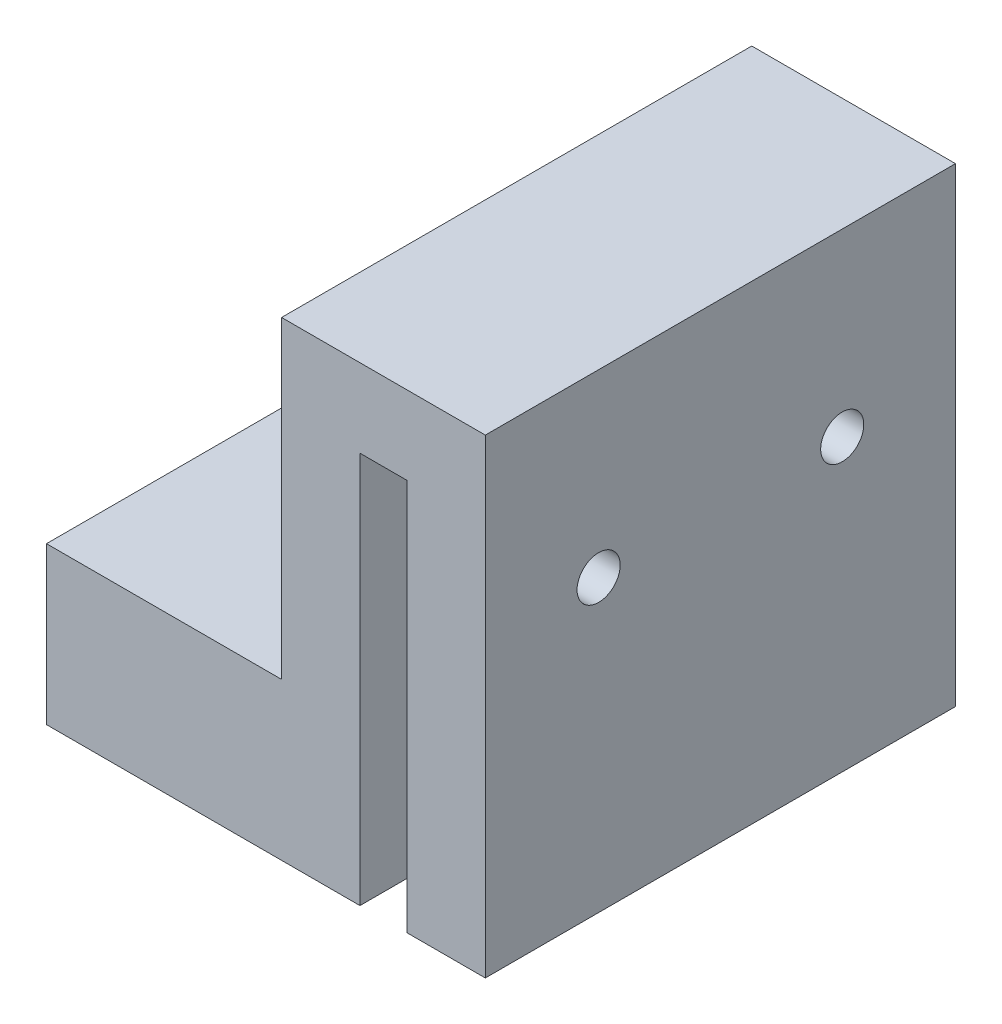
ISO-10303-21;
HEADER;
FILE_DESCRIPTION(('STEP AP214'),'2;1');
FILE_NAME('part.step','',(''),(''),'','','');
FILE_SCHEMA(('AUTOMOTIVE_DESIGN { 1 0 10303 214 1 1 1 1 }'));
ENDSEC;
DATA;
#1=APPLICATION_CONTEXT('core data for automotive mechanical design processes');
#2=APPLICATION_PROTOCOL_DEFINITION('international standard','automotive_design',2000,#1);
#3=PRODUCT_CONTEXT('',#1,'mechanical');
#4=PRODUCT('Part','Part','',(#3));
#5=PRODUCT_RELATED_PRODUCT_CATEGORY('part','',(#4));
#6=PRODUCT_DEFINITION_FORMATION('','',#4);
#7=PRODUCT_DEFINITION_CONTEXT('part definition',#1,'design');
#8=PRODUCT_DEFINITION('design','',#6,#7);
#9=PRODUCT_DEFINITION_SHAPE('','',#8);
#10=(LENGTH_UNIT() NAMED_UNIT(*) SI_UNIT(.MILLI.,.METRE.));
#11=(NAMED_UNIT(*) PLANE_ANGLE_UNIT() SI_UNIT($,.RADIAN.));
#12=(NAMED_UNIT(*) SI_UNIT($,.STERADIAN.) SOLID_ANGLE_UNIT());
#13=UNCERTAINTY_MEASURE_WITH_UNIT(LENGTH_MEASURE(1.E-05),#10,'distance_accuracy_value','');
#14=(GEOMETRIC_REPRESENTATION_CONTEXT(3) GLOBAL_UNCERTAINTY_ASSIGNED_CONTEXT((#13)) GLOBAL_UNIT_ASSIGNED_CONTEXT((#10,
#11,#12)) REPRESENTATION_CONTEXT('',''));
#15=CARTESIAN_POINT('',(0.,0.,0.));
#16=DIRECTION('',(0.,0.,1.));
#17=DIRECTION('',(1.,0.,0.));
#18=AXIS2_PLACEMENT_3D('',#15,#16,#17);
#19=CARTESIAN_POINT('',(-56.,0.,60.));
#20=DIRECTION('',(0.,1.,0.));
#21=DIRECTION('',(0.,0.,1.));
#22=AXIS2_PLACEMENT_3D('',#19,#20,#21);
#23=PLANE('',#22);
#24=DIRECTION('',(1.,0.,0.));
#25=VECTOR('',#24,1.);
#26=CARTESIAN_POINT('',(-56.,0.,0.));
#27=LINE('',#26,#25);
#28=CARTESIAN_POINT('',(-56.,0.,0.));
#29=VERTEX_POINT('',#28);
#30=CARTESIAN_POINT('',(-16.,0.,0.));
#31=VERTEX_POINT('',#30);
#32=EDGE_CURVE('E174',#29,#31,#27,.T.);
#33=ORIENTED_EDGE('',*,*,#32,.T.);
#34=DIRECTION('',(0.,0.,-1.));
#35=VECTOR('',#34,1.);
#36=CARTESIAN_POINT('',(-16.,0.,60.));
#37=LINE('',#36,#35);
#38=CARTESIAN_POINT('',(-16.,0.,60.));
#39=VERTEX_POINT('',#38);
#40=EDGE_CURVE('E151',#39,#31,#37,.T.);
#41=ORIENTED_EDGE('',*,*,#40,.F.);
#42=DIRECTION('',(1.,0.,0.));
#43=VECTOR('',#42,1.);
#44=CARTESIAN_POINT('',(-56.,0.,60.));
#45=LINE('',#44,#43);
#46=CARTESIAN_POINT('',(-56.,0.,60.));
#47=VERTEX_POINT('',#46);
#48=EDGE_CURVE('E139',#47,#39,#45,.T.);
#49=ORIENTED_EDGE('',*,*,#48,.F.);
#50=DIRECTION('',(0.,0.,-1.));
#51=VECTOR('',#50,1.);
#52=CARTESIAN_POINT('',(-56.,0.,60.));
#53=LINE('',#52,#51);
#54=EDGE_CURVE('E184',#47,#29,#53,.T.);
#55=ORIENTED_EDGE('',*,*,#54,.T.);
#56=EDGE_LOOP('',(#33,#41,#49,#55));
#57=FACE_BOUND('',#56,.T.);
#58=DIRECTION('',(0.,0.,-1.));
#59=VECTOR('',#58,1.);
#60=CARTESIAN_POINT('',(-31.,0.,60.));
#61=LINE('',#60,#59);
#62=CARTESIAN_POINT('',(-31.,0.,34.875));
#63=VERTEX_POINT('',#62);
#64=CARTESIAN_POINT('',(-31.,0.,25.125));
#65=VERTEX_POINT('',#64);
#66=EDGE_CURVE('E54',#63,#65,#61,.T.);
#67=ORIENTED_EDGE('',*,*,#66,.T.);
#68=DIRECTION('',(-0.866025403784439,0.,-0.5));
#69=VECTOR('',#68,1.);
#70=CARTESIAN_POINT('',(-34.6486820215088,0.,23.0184324526945));
#71=LINE('',#70,#69);
#72=CARTESIAN_POINT('',(-39.4437476868983,0.,20.25));
#73=VERTEX_POINT('',#72);
#74=EDGE_CURVE('E246',#65,#73,#71,.T.);
#75=ORIENTED_EDGE('',*,*,#74,.T.);
#76=DIRECTION('',(-0.866025403784439,0.,0.5));
#77=VECTOR('',#76,1.);
#78=CARTESIAN_POINT('',(-69.0731918219403,0.,37.3565675473055));
#79=LINE('',#78,#77);
#80=CARTESIAN_POINT('',(-47.8874953737966,0.,25.125));
#81=VERTEX_POINT('',#80);
#82=EDGE_CURVE('E249',#73,#81,#79,.T.);
#83=ORIENTED_EDGE('',*,*,#82,.T.);
#84=DIRECTION('',(0.,0.,1.));
#85=VECTOR('',#84,1.);
#86=CARTESIAN_POINT('',(-47.8874953737966,0.,60.));
#87=LINE('',#86,#85);
#88=CARTESIAN_POINT('',(-47.8874953737966,0.,34.875));
#89=VERTEX_POINT('',#88);
#90=EDGE_CURVE('E252',#81,#89,#87,.T.);
#91=ORIENTED_EDGE('',*,*,#90,.T.);
#92=DIRECTION('',(0.866025403784438,0.,0.500000000000001));
#93=VECTOR('',#92,1.);
#94=CARTESIAN_POINT('',(-43.0924297084071,0.,37.6434324526945));
#95=LINE('',#94,#93);
#96=CARTESIAN_POINT('',(-39.4437476868983,0.,39.75));
#97=VERTEX_POINT('',#96);
#98=EDGE_CURVE('E255',#89,#97,#95,.T.);
#99=ORIENTED_EDGE('',*,*,#98,.T.);
#100=DIRECTION('',(0.866025403784439,0.,-0.5));
#101=VECTOR('',#100,1.);
#102=CARTESIAN_POINT('',(-60.629444135042,0.,51.9815675473055));
#103=LINE('',#102,#101);
#104=EDGE_CURVE('E229',#97,#63,#103,.T.);
#105=ORIENTED_EDGE('',*,*,#104,.T.);
#106=EDGE_LOOP('',(#67,#75,#83,#91,#99,#105));
#107=FACE_BOUND('',#106,.T.);
#108=ADVANCED_FACE('F37',(#57,#107),#23,.F.);
#109=CARTESIAN_POINT('',(-10.,0.,60.));
#110=DIRECTION('',(0.,1.,0.));
#111=DIRECTION('',(0.,0.,1.));
#112=AXIS2_PLACEMENT_3D('',#109,#110,#111);
#113=PLANE('',#112);
#114=DIRECTION('',(1.,0.,0.));
#115=VECTOR('',#114,1.);
#116=CARTESIAN_POINT('',(-10.,0.,0.));
#117=LINE('',#116,#115);
#118=CARTESIAN_POINT('',(-10.,0.,0.));
#119=VERTEX_POINT('',#118);
#120=CARTESIAN_POINT('',(0.,0.,0.));
#121=VERTEX_POINT('',#120);
#122=EDGE_CURVE('E160',#119,#121,#117,.T.);
#123=ORIENTED_EDGE('',*,*,#122,.T.);
#124=DIRECTION('',(0.,0.,-1.));
#125=VECTOR('',#124,1.);
#126=CARTESIAN_POINT('',(0.,0.,60.));
#127=LINE('',#126,#125);
#128=CARTESIAN_POINT('',(0.,0.,60.));
#129=VERTEX_POINT('',#128);
#130=EDGE_CURVE('E11',#129,#121,#127,.T.);
#131=ORIENTED_EDGE('',*,*,#130,.F.);
#132=DIRECTION('',(1.,0.,0.));
#133=VECTOR('',#132,1.);
#134=CARTESIAN_POINT('',(-10.,0.,60.));
#135=LINE('',#134,#133);
#136=CARTESIAN_POINT('',(-10.,0.,60.));
#137=VERTEX_POINT('',#136);
#138=EDGE_CURVE('E180',#137,#129,#135,.T.);
#139=ORIENTED_EDGE('',*,*,#138,.F.);
#140=DIRECTION('',(0.,0.,-1.));
#141=VECTOR('',#140,1.);
#142=CARTESIAN_POINT('',(-10.,0.,60.));
#143=LINE('',#142,#141);
#144=EDGE_CURVE('E156',#137,#119,#143,.T.);
#145=ORIENTED_EDGE('',*,*,#144,.T.);
#146=EDGE_LOOP('',(#123,#131,#139,#145));
#147=FACE_BOUND('',#146,.T.);
#148=ADVANCED_FACE('F39',(#147),#113,.F.);
#149=CARTESIAN_POINT('',(0.,0.,60.));
#150=DIRECTION('',(-1.,0.,0.));
#151=DIRECTION('',(0.,0.,1.));
#152=AXIS2_PLACEMENT_3D('',#149,#150,#151);
#153=PLANE('',#152);
#154=CARTESIAN_POINT('',(0.,37.0311675602959,14.4586466217022));
#155=DIRECTION('',(-1.,0.,0.));
#156=DIRECTION('',(0.,0.,1.));
#157=AXIS2_PLACEMENT_3D('',#154,#155,#156);
#158=CIRCLE('',#157,2.75);
#159=CARTESIAN_POINT('',(0.,37.0311675602959,17.2086466217022));
#160=VERTEX_POINT('',#159);
#161=EDGE_CURVE('E219',#160,#160,#158,.T.);
#162=ORIENTED_EDGE('',*,*,#161,.T.);
#163=EDGE_LOOP('',(#162));
#164=FACE_BOUND('',#163,.T.);
#165=CARTESIAN_POINT('',(0.,37.0311675602959,45.5413533782978));
#166=DIRECTION('',(-1.,0.,0.));
#167=DIRECTION('',(0.,0.,1.));
#168=AXIS2_PLACEMENT_3D('',#165,#166,#167);
#169=CIRCLE('',#168,2.75);
#170=CARTESIAN_POINT('',(0.,37.0311675602959,48.2913533782978));
#171=VERTEX_POINT('',#170);
#172=EDGE_CURVE('E204',#171,#171,#169,.T.);
#173=ORIENTED_EDGE('',*,*,#172,.T.);
#174=EDGE_LOOP('',(#173));
#175=FACE_BOUND('',#174,.T.);
#176=DIRECTION('',(0.,1.,0.));
#177=VECTOR('',#176,1.);
#178=CARTESIAN_POINT('',(0.,0.,0.));
#179=LINE('',#178,#177);
#180=CARTESIAN_POINT('',(0.,60.,0.));
#181=VERTEX_POINT('',#180);
#182=EDGE_CURVE('E163',#121,#181,#179,.T.);
#183=ORIENTED_EDGE('',*,*,#182,.T.);
#184=DIRECTION('',(0.,0.,-1.));
#185=VECTOR('',#184,1.);
#186=CARTESIAN_POINT('',(0.,60.,60.));
#187=LINE('',#186,#185);
#188=CARTESIAN_POINT('',(0.,60.,60.));
#189=VERTEX_POINT('',#188);
#190=EDGE_CURVE('E46',#189,#181,#187,.T.);
#191=ORIENTED_EDGE('',*,*,#190,.F.);
#192=DIRECTION('',(0.,1.,0.));
#193=VECTOR('',#192,1.);
#194=CARTESIAN_POINT('',(0.,0.,60.));
#195=LINE('',#194,#193);
#196=EDGE_CURVE('E110',#129,#189,#195,.T.);
#197=ORIENTED_EDGE('',*,*,#196,.F.);
#198=ORIENTED_EDGE('',*,*,#130,.T.);
#199=EDGE_LOOP('',(#183,#191,#197,#198));
#200=FACE_BOUND('',#199,.T.);
#201=ADVANCED_FACE('F305',(#164,#175,#200),#153,.F.);
#202=CARTESIAN_POINT('',(0.,60.,60.));
#203=DIRECTION('',(0.,-1.,0.));
#204=DIRECTION('',(0.,0.,-1.));
#205=AXIS2_PLACEMENT_3D('',#202,#203,#204);
#206=PLANE('',#205);
#207=DIRECTION('',(-1.,0.,0.));
#208=VECTOR('',#207,1.);
#209=CARTESIAN_POINT('',(0.,60.,0.));
#210=LINE('',#209,#208);
#211=CARTESIAN_POINT('',(-26.,60.,0.));
#212=VERTEX_POINT('',#211);
#213=EDGE_CURVE('E166',#181,#212,#210,.T.);
#214=ORIENTED_EDGE('',*,*,#213,.T.);
#215=DIRECTION('',(0.,0.,-1.));
#216=VECTOR('',#215,1.);
#217=CARTESIAN_POINT('',(-26.,60.,60.));
#218=LINE('',#217,#216);
#219=CARTESIAN_POINT('',(-26.,60.,60.));
#220=VERTEX_POINT('',#219);
#221=EDGE_CURVE('E193',#220,#212,#218,.T.);
#222=ORIENTED_EDGE('',*,*,#221,.F.);
#223=DIRECTION('',(-1.,0.,0.));
#224=VECTOR('',#223,1.);
#225=CARTESIAN_POINT('',(0.,60.,60.));
#226=LINE('',#225,#224);
#227=EDGE_CURVE('E279',#189,#220,#226,.T.);
#228=ORIENTED_EDGE('',*,*,#227,.F.);
#229=ORIENTED_EDGE('',*,*,#190,.T.);
#230=EDGE_LOOP('',(#214,#222,#228,#229));
#231=FACE_BOUND('',#230,.T.);
#232=ADVANCED_FACE('F308',(#231),#206,.F.);
#233=CARTESIAN_POINT('',(-26.,60.,60.));
#234=DIRECTION('',(1.,0.,0.));
#235=DIRECTION('',(0.,1.,0.));
#236=AXIS2_PLACEMENT_3D('',#233,#234,#235);
#237=PLANE('',#236);
#238=CARTESIAN_POINT('',(-26.,37.0311675602959,14.4586466217022));
#239=DIRECTION('',(-1.,0.,0.));
#240=DIRECTION('',(0.,-1.,0.));
#241=AXIS2_PLACEMENT_3D('',#238,#239,#240);
#242=CIRCLE('',#241,2.75);
#243=CARTESIAN_POINT('',(-26.,34.2811675602959,14.4586466217022));
#244=VERTEX_POINT('',#243);
#245=EDGE_CURVE('E200',#244,#244,#242,.T.);
#246=ORIENTED_EDGE('',*,*,#245,.F.);
#247=EDGE_LOOP('',(#246));
#248=FACE_BOUND('',#247,.T.);
#249=CARTESIAN_POINT('',(-26.,37.0311675602959,45.5413533782978));
#250=DIRECTION('',(-1.,0.,0.));
#251=DIRECTION('',(0.,-1.,0.));
#252=AXIS2_PLACEMENT_3D('',#249,#250,#251);
#253=CIRCLE('',#252,2.75);
#254=CARTESIAN_POINT('',(-26.,34.2811675602959,45.5413533782978));
#255=VERTEX_POINT('',#254);
#256=EDGE_CURVE('E207',#255,#255,#253,.T.);
#257=ORIENTED_EDGE('',*,*,#256,.F.);
#258=EDGE_LOOP('',(#257));
#259=FACE_BOUND('',#258,.T.);
#260=DIRECTION('',(0.,-1.,0.));
#261=VECTOR('',#260,1.);
#262=CARTESIAN_POINT('',(-26.,60.,0.));
#263=LINE('',#262,#261);
#264=CARTESIAN_POINT('',(-26.,20.,0.));
#265=VERTEX_POINT('',#264);
#266=EDGE_CURVE('E168',#212,#265,#263,.T.);
#267=ORIENTED_EDGE('',*,*,#266,.T.);
#268=DIRECTION('',(0.,0.,-1.));
#269=VECTOR('',#268,1.);
#270=CARTESIAN_POINT('',(-26.,20.,60.));
#271=LINE('',#270,#269);
#272=CARTESIAN_POINT('',(-26.,20.,60.));
#273=VERTEX_POINT('',#272);
#274=EDGE_CURVE('E190',#273,#265,#271,.T.);
#275=ORIENTED_EDGE('',*,*,#274,.F.);
#276=DIRECTION('',(0.,-1.,0.));
#277=VECTOR('',#276,1.);
#278=CARTESIAN_POINT('',(-26.,60.,60.));
#279=LINE('',#278,#277);
#280=EDGE_CURVE('E281',#220,#273,#279,.T.);
#281=ORIENTED_EDGE('',*,*,#280,.F.);
#282=ORIENTED_EDGE('',*,*,#221,.T.);
#283=EDGE_LOOP('',(#267,#275,#281,#282));
#284=FACE_BOUND('',#283,.T.);
#285=ADVANCED_FACE('F313',(#248,#259,#284),#237,.F.);
#286=CARTESIAN_POINT('',(-26.,20.,60.));
#287=DIRECTION('',(0.,-1.,0.));
#288=DIRECTION('',(1.,0.,0.));
#289=AXIS2_PLACEMENT_3D('',#286,#287,#288);
#290=PLANE('',#289);
#291=CARTESIAN_POINT('',(-39.4437476868983,20.,30.));
#292=DIRECTION('',(0.,1.,0.));
#293=DIRECTION('',(-1.,0.,0.));
#294=AXIS2_PLACEMENT_3D('',#291,#292,#293);
#295=CIRCLE('',#294,5.99999999999999);
#296=CARTESIAN_POINT('',(-45.4437476868983,20.,30.));
#297=VERTEX_POINT('',#296);
#298=EDGE_CURVE('E164',#297,#297,#295,.T.);
#299=ORIENTED_EDGE('',*,*,#298,.F.);
#300=EDGE_LOOP('',(#299));
#301=FACE_BOUND('',#300,.T.);
#302=DIRECTION('',(-1.,0.,0.));
#303=VECTOR('',#302,1.);
#304=CARTESIAN_POINT('',(-26.,20.,0.));
#305=LINE('',#304,#303);
#306=CARTESIAN_POINT('',(-56.,20.,0.));
#307=VERTEX_POINT('',#306);
#308=EDGE_CURVE('E170',#265,#307,#305,.T.);
#309=ORIENTED_EDGE('',*,*,#308,.T.);
#310=DIRECTION('',(0.,0.,-1.));
#311=VECTOR('',#310,1.);
#312=CARTESIAN_POINT('',(-56.,20.,60.));
#313=LINE('',#312,#311);
#314=CARTESIAN_POINT('',(-56.,20.,60.));
#315=VERTEX_POINT('',#314);
#316=EDGE_CURVE('E187',#315,#307,#313,.T.);
#317=ORIENTED_EDGE('',*,*,#316,.F.);
#318=DIRECTION('',(-1.,0.,0.));
#319=VECTOR('',#318,1.);
#320=CARTESIAN_POINT('',(-26.,20.,60.));
#321=LINE('',#320,#319);
#322=EDGE_CURVE('E283',#273,#315,#321,.T.);
#323=ORIENTED_EDGE('',*,*,#322,.F.);
#324=ORIENTED_EDGE('',*,*,#274,.T.);
#325=EDGE_LOOP('',(#309,#317,#323,#324));
#326=FACE_BOUND('',#325,.T.);
#327=ADVANCED_FACE('F316',(#301,#326),#290,.F.);
#328=CARTESIAN_POINT('',(-56.,20.,60.));
#329=DIRECTION('',(1.,0.,0.));
#330=DIRECTION('',(0.,0.,-1.));
#331=AXIS2_PLACEMENT_3D('',#328,#329,#330);
#332=PLANE('',#331);
#333=DIRECTION('',(0.,-1.,0.));
#334=VECTOR('',#333,1.);
#335=CARTESIAN_POINT('',(-56.,20.,0.));
#336=LINE('',#335,#334);
#337=EDGE_CURVE('E172',#307,#29,#336,.T.);
#338=ORIENTED_EDGE('',*,*,#337,.T.);
#339=ORIENTED_EDGE('',*,*,#54,.F.);
#340=DIRECTION('',(0.,-1.,0.));
#341=VECTOR('',#340,1.);
#342=CARTESIAN_POINT('',(-56.,20.,60.));
#343=LINE('',#342,#341);
#344=EDGE_CURVE('E285',#315,#47,#343,.T.);
#345=ORIENTED_EDGE('',*,*,#344,.F.);
#346=ORIENTED_EDGE('',*,*,#316,.T.);
#347=EDGE_LOOP('',(#338,#339,#345,#346));
#348=FACE_BOUND('',#347,.T.);
#349=ADVANCED_FACE('F291',(#348),#332,.F.);
#350=CARTESIAN_POINT('',(-16.,0.,60.));
#351=DIRECTION('',(-1.,0.,0.));
#352=DIRECTION('',(0.,0.,1.));
#353=AXIS2_PLACEMENT_3D('',#350,#351,#352);
#354=PLANE('',#353);
#355=CARTESIAN_POINT('',(-16.,37.0311675602959,14.4586466217022));
#356=DIRECTION('',(-1.,0.,0.));
#357=DIRECTION('',(0.,0.,1.));
#358=AXIS2_PLACEMENT_3D('',#355,#356,#357);
#359=CIRCLE('',#358,2.75);
#360=CARTESIAN_POINT('',(-16.,37.0311675602959,17.2086466217022));
#361=VERTEX_POINT('',#360);
#362=EDGE_CURVE('E216',#361,#361,#359,.T.);
#363=ORIENTED_EDGE('',*,*,#362,.T.);
#364=EDGE_LOOP('',(#363));
#365=FACE_BOUND('',#364,.T.);
#366=CARTESIAN_POINT('',(-16.,37.0311675602959,45.5413533782978));
#367=DIRECTION('',(-1.,0.,0.));
#368=DIRECTION('',(0.,0.,1.));
#369=AXIS2_PLACEMENT_3D('',#366,#367,#368);
#370=CIRCLE('',#369,2.75);
#371=CARTESIAN_POINT('',(-16.,37.0311675602959,48.2913533782978));
#372=VERTEX_POINT('',#371);
#373=EDGE_CURVE('E199',#372,#372,#370,.T.);
#374=ORIENTED_EDGE('',*,*,#373,.T.);
#375=EDGE_LOOP('',(#374));
#376=FACE_BOUND('',#375,.T.);
#377=DIRECTION('',(0.,1.,0.));
#378=VECTOR('',#377,1.);
#379=CARTESIAN_POINT('',(-16.,0.,0.));
#380=LINE('',#379,#378);
#381=CARTESIAN_POINT('',(-16.,50.,0.));
#382=VERTEX_POINT('',#381);
#383=EDGE_CURVE('E148',#31,#382,#380,.T.);
#384=ORIENTED_EDGE('',*,*,#383,.T.);
#385=DIRECTION('',(0.,0.,-1.));
#386=VECTOR('',#385,1.);
#387=CARTESIAN_POINT('',(-16.,50.,60.));
#388=LINE('',#387,#386);
#389=CARTESIAN_POINT('',(-16.,50.,60.));
#390=VERTEX_POINT('',#389);
#391=EDGE_CURVE('E145',#390,#382,#388,.T.);
#392=ORIENTED_EDGE('',*,*,#391,.F.);
#393=DIRECTION('',(0.,1.,0.));
#394=VECTOR('',#393,1.);
#395=CARTESIAN_POINT('',(-16.,0.,60.));
#396=LINE('',#395,#394);
#397=EDGE_CURVE('E132',#39,#390,#396,.T.);
#398=ORIENTED_EDGE('',*,*,#397,.F.);
#399=ORIENTED_EDGE('',*,*,#40,.T.);
#400=EDGE_LOOP('',(#384,#392,#398,#399));
#401=FACE_BOUND('',#400,.T.);
#402=ADVANCED_FACE('F146',(#365,#376,#401),#354,.F.);
#403=CARTESIAN_POINT('',(-10.,50.,60.));
#404=DIRECTION('',(0.,1.,0.));
#405=DIRECTION('',(0.,0.,1.));
#406=AXIS2_PLACEMENT_3D('',#403,#404,#405);
#407=PLANE('',#406);
#408=DIRECTION('',(1.,0.,0.));
#409=VECTOR('',#408,1.);
#410=CARTESIAN_POINT('',(-10.,50.,0.));
#411=LINE('',#410,#409);
#412=CARTESIAN_POINT('',(-10.,50.,0.));
#413=VERTEX_POINT('',#412);
#414=EDGE_CURVE('E177',#382,#413,#411,.T.);
#415=ORIENTED_EDGE('',*,*,#414,.T.);
#416=DIRECTION('',(0.,0.,-1.));
#417=VECTOR('',#416,1.);
#418=CARTESIAN_POINT('',(-10.,50.,60.));
#419=LINE('',#418,#417);
#420=CARTESIAN_POINT('',(-10.,50.,60.));
#421=VERTEX_POINT('',#420);
#422=EDGE_CURVE('E152',#421,#413,#419,.T.);
#423=ORIENTED_EDGE('',*,*,#422,.F.);
#424=DIRECTION('',(1.,0.,0.));
#425=VECTOR('',#424,1.);
#426=CARTESIAN_POINT('',(-10.,50.,60.));
#427=LINE('',#426,#425);
#428=EDGE_CURVE('E136',#390,#421,#427,.T.);
#429=ORIENTED_EDGE('',*,*,#428,.F.);
#430=ORIENTED_EDGE('',*,*,#391,.T.);
#431=EDGE_LOOP('',(#415,#423,#429,#430));
#432=FACE_BOUND('',#431,.T.);
#433=ADVANCED_FACE('F154',(#432),#407,.F.);
#434=CARTESIAN_POINT('',(-10.,0.,60.));
#435=DIRECTION('',(1.,0.,0.));
#436=DIRECTION('',(0.,1.,0.));
#437=AXIS2_PLACEMENT_3D('',#434,#435,#436);
#438=PLANE('',#437);
#439=CARTESIAN_POINT('',(-10.,37.0311675602959,14.4586466217022));
#440=DIRECTION('',(1.,0.,0.));
#441=DIRECTION('',(0.,1.,0.));
#442=AXIS2_PLACEMENT_3D('',#439,#440,#441);
#443=CIRCLE('',#442,2.75);
#444=CARTESIAN_POINT('',(-10.,39.7811675602959,14.4586466217022));
#445=VERTEX_POINT('',#444);
#446=EDGE_CURVE('E41',#445,#445,#443,.T.);
#447=ORIENTED_EDGE('',*,*,#446,.T.);
#448=EDGE_LOOP('',(#447));
#449=FACE_BOUND('',#448,.T.);
#450=CARTESIAN_POINT('',(-10.,37.0311675602959,45.5413533782978));
#451=DIRECTION('',(1.,0.,0.));
#452=DIRECTION('',(0.,1.,0.));
#453=AXIS2_PLACEMENT_3D('',#450,#451,#452);
#454=CIRCLE('',#453,2.75);
#455=CARTESIAN_POINT('',(-10.,39.7811675602959,45.5413533782978));
#456=VERTEX_POINT('',#455);
#457=EDGE_CURVE('E197',#456,#456,#454,.T.);
#458=ORIENTED_EDGE('',*,*,#457,.T.);
#459=EDGE_LOOP('',(#458));
#460=FACE_BOUND('',#459,.T.);
#461=DIRECTION('',(0.,-1.,0.));
#462=VECTOR('',#461,1.);
#463=CARTESIAN_POINT('',(-10.,0.,0.));
#464=LINE('',#463,#462);
#465=EDGE_CURVE('E102',#413,#119,#464,.T.);
#466=ORIENTED_EDGE('',*,*,#465,.T.);
#467=ORIENTED_EDGE('',*,*,#144,.F.);
#468=DIRECTION('',(0.,-1.,0.));
#469=VECTOR('',#468,1.);
#470=CARTESIAN_POINT('',(-10.,0.,60.));
#471=LINE('',#470,#469);
#472=EDGE_CURVE('E63',#421,#137,#471,.T.);
#473=ORIENTED_EDGE('',*,*,#472,.F.);
#474=ORIENTED_EDGE('',*,*,#422,.T.);
#475=EDGE_LOOP('',(#466,#467,#473,#474));
#476=FACE_BOUND('',#475,.T.);
#477=ADVANCED_FACE('F299',(#449,#460,#476),#438,.F.);
#478=CARTESIAN_POINT('',(0.,0.,60.));
#479=DIRECTION('',(0.,0.,1.));
#480=DIRECTION('',(1.,0.,0.));
#481=AXIS2_PLACEMENT_3D('',#478,#479,#480);
#482=PLANE('',#481);
#483=ORIENTED_EDGE('',*,*,#138,.T.);
#484=ORIENTED_EDGE('',*,*,#196,.T.);
#485=ORIENTED_EDGE('',*,*,#227,.T.);
#486=ORIENTED_EDGE('',*,*,#280,.T.);
#487=ORIENTED_EDGE('',*,*,#322,.T.);
#488=ORIENTED_EDGE('',*,*,#344,.T.);
#489=ORIENTED_EDGE('',*,*,#48,.T.);
#490=ORIENTED_EDGE('',*,*,#397,.T.);
#491=ORIENTED_EDGE('',*,*,#428,.T.);
#492=ORIENTED_EDGE('',*,*,#472,.T.);
#493=EDGE_LOOP('',(#483,#484,#485,#486,#487,#488,#489,#490,#491,#492));
#494=FACE_BOUND('',#493,.T.);
#495=ADVANCED_FACE('F134',(#494),#482,.T.);
#496=CARTESIAN_POINT('',(0.,0.,0.));
#497=DIRECTION('',(0.,0.,1.));
#498=DIRECTION('',(1.,0.,0.));
#499=AXIS2_PLACEMENT_3D('',#496,#497,#498);
#500=PLANE('',#499);
#501=ORIENTED_EDGE('',*,*,#122,.F.);
#502=ORIENTED_EDGE('',*,*,#465,.F.);
#503=ORIENTED_EDGE('',*,*,#414,.F.);
#504=ORIENTED_EDGE('',*,*,#383,.F.);
#505=ORIENTED_EDGE('',*,*,#32,.F.);
#506=ORIENTED_EDGE('',*,*,#337,.F.);
#507=ORIENTED_EDGE('',*,*,#308,.F.);
#508=ORIENTED_EDGE('',*,*,#266,.F.);
#509=ORIENTED_EDGE('',*,*,#213,.F.);
#510=ORIENTED_EDGE('',*,*,#182,.F.);
#511=EDGE_LOOP('',(#501,#502,#503,#504,#505,#506,#507,#508,#509,#510));
#512=FACE_BOUND('',#511,.T.);
#513=ADVANCED_FACE('F298',(#512),#500,.F.);
#514=CARTESIAN_POINT('',(-39.4437476868983,-3.99999999999999,30.));
#515=DIRECTION('',(0.,1.,0.));
#516=DIRECTION('',(-1.,0.,0.));
#517=AXIS2_PLACEMENT_3D('',#514,#515,#516);
#518=CYLINDRICAL_SURFACE('',#517,5.99999999999999);
#519=CARTESIAN_POINT('',(-39.4437476868983,8.,30.));
#520=DIRECTION('',(0.,1.,0.));
#521=DIRECTION('',(0.,0.,1.));
#522=AXIS2_PLACEMENT_3D('',#519,#520,#521);
#523=CIRCLE('',#522,5.99999999999999);
#524=CARTESIAN_POINT('',(-39.4437476868983,8.,36.));
#525=VERTEX_POINT('',#524);
#526=EDGE_CURVE('E222',#525,#525,#523,.T.);
#527=ORIENTED_EDGE('',*,*,#526,.F.);
#528=EDGE_LOOP('',(#527));
#529=FACE_BOUND('',#528,.T.);
#530=ORIENTED_EDGE('',*,*,#298,.T.);
#531=EDGE_LOOP('',(#530));
#532=FACE_BOUND('',#531,.T.);
#533=ADVANCED_FACE('F344',(#529,#532),#518,.F.);
#534=CARTESIAN_POINT('',(0.,8.,0.));
#535=DIRECTION('',(0.,1.,0.));
#536=DIRECTION('',(0.,0.,1.));
#537=AXIS2_PLACEMENT_3D('',#534,#535,#536);
#538=PLANE('',#537);
#539=DIRECTION('',(0.,0.,-1.));
#540=VECTOR('',#539,1.);
#541=CARTESIAN_POINT('',(-31.,8.,60.));
#542=LINE('',#541,#540);
#543=CARTESIAN_POINT('',(-31.,8.,34.875));
#544=VERTEX_POINT('',#543);
#545=CARTESIAN_POINT('',(-31.,8.,25.125));
#546=VERTEX_POINT('',#545);
#547=EDGE_CURVE('E225',#544,#546,#542,.T.);
#548=ORIENTED_EDGE('',*,*,#547,.F.);
#549=DIRECTION('',(0.866025403784439,0.,-0.5));
#550=VECTOR('',#549,1.);
#551=CARTESIAN_POINT('',(-60.629444135042,8.,51.9815675473055));
#552=LINE('',#551,#550);
#553=CARTESIAN_POINT('',(-39.4437476868983,8.,39.75));
#554=VERTEX_POINT('',#553);
#555=EDGE_CURVE('E241',#554,#544,#552,.T.);
#556=ORIENTED_EDGE('',*,*,#555,.F.);
#557=DIRECTION('',(0.866025403784438,0.,0.500000000000001));
#558=VECTOR('',#557,1.);
#559=CARTESIAN_POINT('',(-43.0924297084071,8.,37.6434324526945));
#560=LINE('',#559,#558);
#561=CARTESIAN_POINT('',(-47.8874953737966,8.,34.875));
#562=VERTEX_POINT('',#561);
#563=EDGE_CURVE('E238',#562,#554,#560,.T.);
#564=ORIENTED_EDGE('',*,*,#563,.F.);
#565=DIRECTION('',(0.,0.,1.));
#566=VECTOR('',#565,1.);
#567=CARTESIAN_POINT('',(-47.8874953737966,8.,60.));
#568=LINE('',#567,#566);
#569=CARTESIAN_POINT('',(-47.8874953737966,8.,25.125));
#570=VERTEX_POINT('',#569);
#571=EDGE_CURVE('E235',#570,#562,#568,.T.);
#572=ORIENTED_EDGE('',*,*,#571,.F.);
#573=DIRECTION('',(-0.866025403784439,0.,0.5));
#574=VECTOR('',#573,1.);
#575=CARTESIAN_POINT('',(-69.0731918219403,8.,37.3565675473055));
#576=LINE('',#575,#574);
#577=CARTESIAN_POINT('',(-39.4437476868983,8.,20.25));
#578=VERTEX_POINT('',#577);
#579=EDGE_CURVE('E232',#578,#570,#576,.T.);
#580=ORIENTED_EDGE('',*,*,#579,.F.);
#581=DIRECTION('',(-0.866025403784439,0.,-0.5));
#582=VECTOR('',#581,1.);
#583=CARTESIAN_POINT('',(-34.6486820215088,8.,23.0184324526945));
#584=LINE('',#583,#582);
#585=EDGE_CURVE('E228',#546,#578,#584,.T.);
#586=ORIENTED_EDGE('',*,*,#585,.F.);
#587=EDGE_LOOP('',(#548,#556,#564,#572,#580,#586));
#588=FACE_BOUND('',#587,.T.);
#589=ORIENTED_EDGE('',*,*,#526,.T.);
#590=EDGE_LOOP('',(#589));
#591=FACE_BOUND('',#590,.T.);
#592=ADVANCED_FACE('F349',(#588,#591),#538,.F.);
#593=CARTESIAN_POINT('',(-31.,8.,60.));
#594=DIRECTION('',(-1.,0.,0.));
#595=DIRECTION('',(0.,0.,1.));
#596=AXIS2_PLACEMENT_3D('',#593,#594,#595);
#597=PLANE('',#596);
#598=ORIENTED_EDGE('',*,*,#66,.F.);
#599=DIRECTION('',(0.,-1.,0.));
#600=VECTOR('',#599,1.);
#601=CARTESIAN_POINT('',(-31.,8.,34.875));
#602=LINE('',#601,#600);
#603=EDGE_CURVE('E244',#544,#63,#602,.T.);
#604=ORIENTED_EDGE('',*,*,#603,.F.);
#605=ORIENTED_EDGE('',*,*,#547,.T.);
#606=DIRECTION('',(0.,-1.,0.));
#607=VECTOR('',#606,1.);
#608=CARTESIAN_POINT('',(-31.,8.,25.125));
#609=LINE('',#608,#607);
#610=EDGE_CURVE('E273',#546,#65,#609,.T.);
#611=ORIENTED_EDGE('',*,*,#610,.T.);
#612=EDGE_LOOP('',(#598,#604,#605,#611));
#613=FACE_BOUND('',#612,.T.);
#614=ADVANCED_FACE('F351',(#613),#597,.T.);
#615=CARTESIAN_POINT('',(-34.6486820215088,8.,23.0184324526945));
#616=DIRECTION('',(-0.5,0.,0.866025403784439));
#617=DIRECTION('',(0.866025403784439,0.,0.5));
#618=AXIS2_PLACEMENT_3D('',#615,#616,#617);
#619=PLANE('',#618);
#620=ORIENTED_EDGE('',*,*,#74,.F.);
#621=ORIENTED_EDGE('',*,*,#610,.F.);
#622=ORIENTED_EDGE('',*,*,#585,.T.);
#623=DIRECTION('',(0.,-1.,0.));
#624=VECTOR('',#623,1.);
#625=CARTESIAN_POINT('',(-39.4437476868983,8.,20.25));
#626=LINE('',#625,#624);
#627=EDGE_CURVE('E270',#578,#73,#626,.T.);
#628=ORIENTED_EDGE('',*,*,#627,.T.);
#629=EDGE_LOOP('',(#620,#621,#622,#628));
#630=FACE_BOUND('',#629,.T.);
#631=ADVANCED_FACE('F354',(#630),#619,.T.);
#632=CARTESIAN_POINT('',(-69.0731918219403,8.,37.3565675473055));
#633=DIRECTION('',(0.5,0.,0.866025403784439));
#634=DIRECTION('',(0.866025403784439,0.,-0.5));
#635=AXIS2_PLACEMENT_3D('',#632,#633,#634);
#636=PLANE('',#635);
#637=ORIENTED_EDGE('',*,*,#82,.F.);
#638=ORIENTED_EDGE('',*,*,#627,.F.);
#639=ORIENTED_EDGE('',*,*,#579,.T.);
#640=DIRECTION('',(0.,-1.,0.));
#641=VECTOR('',#640,1.);
#642=CARTESIAN_POINT('',(-47.8874953737966,8.,25.125));
#643=LINE('',#642,#641);
#644=EDGE_CURVE('E267',#570,#81,#643,.T.);
#645=ORIENTED_EDGE('',*,*,#644,.T.);
#646=EDGE_LOOP('',(#637,#638,#639,#645));
#647=FACE_BOUND('',#646,.T.);
#648=ADVANCED_FACE('F357',(#647),#636,.T.);
#649=CARTESIAN_POINT('',(-47.8874953737966,8.,60.));
#650=DIRECTION('',(1.,0.,0.));
#651=DIRECTION('',(0.,0.,-1.));
#652=AXIS2_PLACEMENT_3D('',#649,#650,#651);
#653=PLANE('',#652);
#654=ORIENTED_EDGE('',*,*,#90,.F.);
#655=ORIENTED_EDGE('',*,*,#644,.F.);
#656=ORIENTED_EDGE('',*,*,#571,.T.);
#657=DIRECTION('',(0.,-1.,0.));
#658=VECTOR('',#657,1.);
#659=CARTESIAN_POINT('',(-47.8874953737966,8.,34.875));
#660=LINE('',#659,#658);
#661=EDGE_CURVE('E264',#562,#89,#660,.T.);
#662=ORIENTED_EDGE('',*,*,#661,.T.);
#663=EDGE_LOOP('',(#654,#655,#656,#662));
#664=FACE_BOUND('',#663,.T.);
#665=ADVANCED_FACE('F361',(#664),#653,.T.);
#666=CARTESIAN_POINT('',(-43.0924297084071,8.,37.6434324526945));
#667=DIRECTION('',(0.500000000000001,0.,-0.866025403784438));
#668=DIRECTION('',(-0.866025403784438,0.,-0.500000000000001));
#669=AXIS2_PLACEMENT_3D('',#666,#667,#668);
#670=PLANE('',#669);
#671=ORIENTED_EDGE('',*,*,#98,.F.);
#672=ORIENTED_EDGE('',*,*,#661,.F.);
#673=ORIENTED_EDGE('',*,*,#563,.T.);
#674=DIRECTION('',(0.,-1.,0.));
#675=VECTOR('',#674,1.);
#676=CARTESIAN_POINT('',(-39.4437476868983,8.,39.75));
#677=LINE('',#676,#675);
#678=EDGE_CURVE('E261',#554,#97,#677,.T.);
#679=ORIENTED_EDGE('',*,*,#678,.T.);
#680=EDGE_LOOP('',(#671,#672,#673,#679));
#681=FACE_BOUND('',#680,.T.);
#682=ADVANCED_FACE('F365',(#681),#670,.T.);
#683=CARTESIAN_POINT('',(-60.629444135042,8.,51.9815675473055));
#684=DIRECTION('',(-0.5,0.,-0.866025403784439));
#685=DIRECTION('',(-0.866025403784439,0.,0.5));
#686=AXIS2_PLACEMENT_3D('',#683,#684,#685);
#687=PLANE('',#686);
#688=ORIENTED_EDGE('',*,*,#104,.F.);
#689=ORIENTED_EDGE('',*,*,#678,.F.);
#690=ORIENTED_EDGE('',*,*,#555,.T.);
#691=ORIENTED_EDGE('',*,*,#603,.T.);
#692=EDGE_LOOP('',(#688,#689,#690,#691));
#693=FACE_BOUND('',#692,.T.);
#694=ADVANCED_FACE('F369',(#693),#687,.T.);
#695=CARTESIAN_POINT('',(4.,37.0311675602959,45.5413533782978));
#696=DIRECTION('',(-1.,0.,0.));
#697=DIRECTION('',(0.,-1.,0.));
#698=AXIS2_PLACEMENT_3D('',#695,#696,#697);
#699=CYLINDRICAL_SURFACE('',#698,2.75);
#700=ORIENTED_EDGE('',*,*,#457,.F.);
#701=EDGE_LOOP('',(#700));
#702=FACE_BOUND('',#701,.T.);
#703=ORIENTED_EDGE('',*,*,#172,.F.);
#704=EDGE_LOOP('',(#703));
#705=FACE_BOUND('',#704,.T.);
#706=ADVANCED_FACE('F373',(#702,#705),#699,.F.);
#707=CARTESIAN_POINT('',(4.,37.0311675602959,14.4586466217022));
#708=DIRECTION('',(-1.,0.,0.));
#709=DIRECTION('',(0.,-1.,0.));
#710=AXIS2_PLACEMENT_3D('',#707,#708,#709);
#711=CYLINDRICAL_SURFACE('',#710,2.75);
#712=ORIENTED_EDGE('',*,*,#446,.F.);
#713=EDGE_LOOP('',(#712));
#714=FACE_BOUND('',#713,.T.);
#715=ORIENTED_EDGE('',*,*,#161,.F.);
#716=EDGE_LOOP('',(#715));
#717=FACE_BOUND('',#716,.T.);
#718=ADVANCED_FACE('F380',(#714,#717),#711,.F.);
#719=ORIENTED_EDGE('',*,*,#256,.T.);
#720=EDGE_LOOP('',(#719));
#721=FACE_BOUND('',#720,.T.);
#722=ORIENTED_EDGE('',*,*,#373,.F.);
#723=EDGE_LOOP('',(#722));
#724=FACE_BOUND('',#723,.T.);
#725=ADVANCED_FACE('F382',(#721,#724),#699,.F.);
#726=ORIENTED_EDGE('',*,*,#245,.T.);
#727=EDGE_LOOP('',(#726));
#728=FACE_BOUND('',#727,.T.);
#729=ORIENTED_EDGE('',*,*,#362,.F.);
#730=EDGE_LOOP('',(#729));
#731=FACE_BOUND('',#730,.T.);
#732=ADVANCED_FACE('F385',(#728,#731),#711,.F.);
#733=CLOSED_SHELL('',(#108,#148,#201,#232,#285,#327,#349,#402,#433,#477,#495,#513,#533,#592,
#614,#631,#648,#665,#682,#694,#706,#718,#725,#732));
#734=MANIFOLD_SOLID_BREP('B2',#733);
#735=ADVANCED_BREP_SHAPE_REPRESENTATION('',(#18,#734),#14);
#736=SHAPE_DEFINITION_REPRESENTATION(#9,#735);
ENDSEC;
END-ISO-10303-21;
